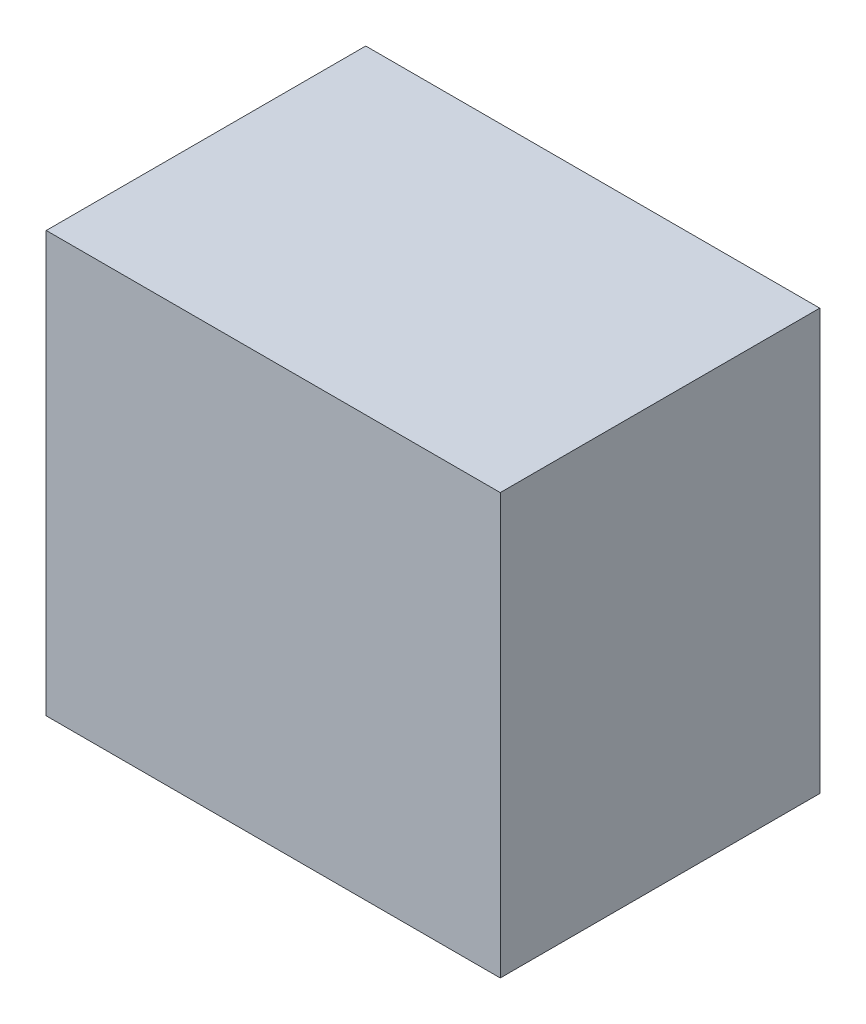
ISO-10303-21;
HEADER;
FILE_DESCRIPTION(('STEP AP214'),'2;1');
FILE_NAME('part.step','',(''),(''),'','','');
FILE_SCHEMA(('AUTOMOTIVE_DESIGN { 1 0 10303 214 1 1 1 1 }'));
ENDSEC;
DATA;
#1=APPLICATION_CONTEXT('core data for automotive mechanical design processes');
#2=APPLICATION_PROTOCOL_DEFINITION('international standard','automotive_design',2000,#1);
#3=PRODUCT_CONTEXT('',#1,'mechanical');
#4=PRODUCT('Part','Part','',(#3));
#5=PRODUCT_RELATED_PRODUCT_CATEGORY('part','',(#4));
#6=PRODUCT_DEFINITION_FORMATION('','',#4);
#7=PRODUCT_DEFINITION_CONTEXT('part definition',#1,'design');
#8=PRODUCT_DEFINITION('design','',#6,#7);
#9=PRODUCT_DEFINITION_SHAPE('','',#8);
#10=(LENGTH_UNIT() NAMED_UNIT(*) SI_UNIT(.MILLI.,.METRE.));
#11=(NAMED_UNIT(*) PLANE_ANGLE_UNIT() SI_UNIT($,.RADIAN.));
#12=(NAMED_UNIT(*) SI_UNIT($,.STERADIAN.) SOLID_ANGLE_UNIT());
#13=UNCERTAINTY_MEASURE_WITH_UNIT(LENGTH_MEASURE(1.E-05),#10,'distance_accuracy_value','');
#14=(GEOMETRIC_REPRESENTATION_CONTEXT(3) GLOBAL_UNCERTAINTY_ASSIGNED_CONTEXT((#13)) GLOBAL_UNIT_ASSIGNED_CONTEXT((#10,
#11,#12)) REPRESENTATION_CONTEXT('',''));
#15=CARTESIAN_POINT('',(0.,0.,0.));
#16=DIRECTION('',(0.,0.,1.));
#17=DIRECTION('',(1.,0.,0.));
#18=AXIS2_PLACEMENT_3D('',#15,#16,#17);
#19=CARTESIAN_POINT('',(0.,5.,0.));
#20=DIRECTION('',(1.,0.,0.));
#21=DIRECTION('',(0.,0.,-1.));
#22=AXIS2_PLACEMENT_3D('',#19,#20,#21);
#23=PLANE('',#22);
#24=DIRECTION('',(0.,0.,1.));
#25=VECTOR('',#24,1.);
#26=CARTESIAN_POINT('',(0.,0.,0.));
#27=LINE('',#26,#25);
#28=CARTESIAN_POINT('',(0.,0.,-3.8));
#29=VERTEX_POINT('',#28);
#30=CARTESIAN_POINT('',(0.,0.,0.));
#31=VERTEX_POINT('',#30);
#32=EDGE_CURVE('E98',#29,#31,#27,.T.);
#33=ORIENTED_EDGE('',*,*,#32,.T.);
#34=DIRECTION('',(0.,-1.,0.));
#35=VECTOR('',#34,1.);
#36=CARTESIAN_POINT('',(0.,5.,0.));
#37=LINE('',#36,#35);
#38=CARTESIAN_POINT('',(0.,5.,0.));
#39=VERTEX_POINT('',#38);
#40=EDGE_CURVE('E11',#39,#31,#37,.T.);
#41=ORIENTED_EDGE('',*,*,#40,.F.);
#42=DIRECTION('',(0.,0.,1.));
#43=VECTOR('',#42,1.);
#44=CARTESIAN_POINT('',(0.,5.,0.));
#45=LINE('',#44,#43);
#46=CARTESIAN_POINT('',(0.,5.,-3.8));
#47=VERTEX_POINT('',#46);
#48=EDGE_CURVE('E86',#47,#39,#45,.T.);
#49=ORIENTED_EDGE('',*,*,#48,.F.);
#50=DIRECTION('',(0.,-1.,0.));
#51=VECTOR('',#50,1.);
#52=CARTESIAN_POINT('',(0.,5.,-3.8));
#53=LINE('',#52,#51);
#54=EDGE_CURVE('E94',#47,#29,#53,.T.);
#55=ORIENTED_EDGE('',*,*,#54,.T.);
#56=EDGE_LOOP('',(#33,#41,#49,#55));
#57=FACE_BOUND('',#56,.T.);
#58=ADVANCED_FACE('F35',(#57),#23,.F.);
#59=CARTESIAN_POINT('',(0.,5.,0.));
#60=DIRECTION('',(0.,0.,-1.));
#61=DIRECTION('',(-1.,0.,0.));
#62=AXIS2_PLACEMENT_3D('',#59,#60,#61);
#63=PLANE('',#62);
#64=DIRECTION('',(1.,0.,0.));
#65=VECTOR('',#64,1.);
#66=CARTESIAN_POINT('',(0.,0.,0.));
#67=LINE('',#66,#65);
#68=CARTESIAN_POINT('',(5.4,0.,0.));
#69=VERTEX_POINT('',#68);
#70=EDGE_CURVE('E90',#31,#69,#67,.T.);
#71=ORIENTED_EDGE('',*,*,#70,.T.);
#72=DIRECTION('',(0.,-1.,0.));
#73=VECTOR('',#72,1.);
#74=CARTESIAN_POINT('',(5.4,5.,0.));
#75=LINE('',#74,#73);
#76=CARTESIAN_POINT('',(5.4,5.,0.));
#77=VERTEX_POINT('',#76);
#78=EDGE_CURVE('E43',#77,#69,#75,.T.);
#79=ORIENTED_EDGE('',*,*,#78,.F.);
#80=DIRECTION('',(1.,0.,0.));
#81=VECTOR('',#80,1.);
#82=CARTESIAN_POINT('',(0.,5.,0.));
#83=LINE('',#82,#81);
#84=EDGE_CURVE('E81',#39,#77,#83,.T.);
#85=ORIENTED_EDGE('',*,*,#84,.F.);
#86=ORIENTED_EDGE('',*,*,#40,.T.);
#87=EDGE_LOOP('',(#71,#79,#85,#86));
#88=FACE_BOUND('',#87,.T.);
#89=ADVANCED_FACE('F89',(#88),#63,.F.);
#90=CARTESIAN_POINT('',(5.4,5.,0.));
#91=DIRECTION('',(-1.,0.,0.));
#92=DIRECTION('',(0.,0.,1.));
#93=AXIS2_PLACEMENT_3D('',#90,#91,#92);
#94=PLANE('',#93);
#95=DIRECTION('',(0.,0.,-1.));
#96=VECTOR('',#95,1.);
#97=CARTESIAN_POINT('',(5.4,0.,0.));
#98=LINE('',#97,#96);
#99=CARTESIAN_POINT('',(5.4,0.,-3.8));
#100=VERTEX_POINT('',#99);
#101=EDGE_CURVE('E68',#69,#100,#98,.T.);
#102=ORIENTED_EDGE('',*,*,#101,.T.);
#103=DIRECTION('',(0.,-1.,0.));
#104=VECTOR('',#103,1.);
#105=CARTESIAN_POINT('',(5.4,5.,-3.8));
#106=LINE('',#105,#104);
#107=CARTESIAN_POINT('',(5.4,5.,-3.8));
#108=VERTEX_POINT('',#107);
#109=EDGE_CURVE('E91',#108,#100,#106,.T.);
#110=ORIENTED_EDGE('',*,*,#109,.F.);
#111=DIRECTION('',(0.,0.,-1.));
#112=VECTOR('',#111,1.);
#113=CARTESIAN_POINT('',(5.4,5.,0.));
#114=LINE('',#113,#112);
#115=EDGE_CURVE('E84',#77,#108,#114,.T.);
#116=ORIENTED_EDGE('',*,*,#115,.F.);
#117=ORIENTED_EDGE('',*,*,#78,.T.);
#118=EDGE_LOOP('',(#102,#110,#116,#117));
#119=FACE_BOUND('',#118,.T.);
#120=ADVANCED_FACE('F92',(#119),#94,.F.);
#121=CARTESIAN_POINT('',(0.,5.,-3.8));
#122=DIRECTION('',(0.,0.,1.));
#123=DIRECTION('',(1.,0.,0.));
#124=AXIS2_PLACEMENT_3D('',#121,#122,#123);
#125=PLANE('',#124);
#126=DIRECTION('',(-1.,0.,0.));
#127=VECTOR('',#126,1.);
#128=CARTESIAN_POINT('',(0.,0.,-3.8));
#129=LINE('',#128,#127);
#130=EDGE_CURVE('E74',#100,#29,#129,.T.);
#131=ORIENTED_EDGE('',*,*,#130,.T.);
#132=ORIENTED_EDGE('',*,*,#54,.F.);
#133=DIRECTION('',(-1.,0.,0.));
#134=VECTOR('',#133,1.);
#135=CARTESIAN_POINT('',(0.,5.,-3.8));
#136=LINE('',#135,#134);
#137=EDGE_CURVE('E51',#108,#47,#136,.T.);
#138=ORIENTED_EDGE('',*,*,#137,.F.);
#139=ORIENTED_EDGE('',*,*,#109,.T.);
#140=EDGE_LOOP('',(#131,#132,#138,#139));
#141=FACE_BOUND('',#140,.T.);
#142=ADVANCED_FACE('F105',(#141),#125,.F.);
#143=CARTESIAN_POINT('',(0.,5.,0.));
#144=DIRECTION('',(0.,-1.,0.));
#145=DIRECTION('',(0.,0.,-1.));
#146=AXIS2_PLACEMENT_3D('',#143,#144,#145);
#147=PLANE('',#146);
#148=ORIENTED_EDGE('',*,*,#48,.T.);
#149=ORIENTED_EDGE('',*,*,#84,.T.);
#150=ORIENTED_EDGE('',*,*,#115,.T.);
#151=ORIENTED_EDGE('',*,*,#137,.T.);
#152=EDGE_LOOP('',(#148,#149,#150,#151));
#153=FACE_BOUND('',#152,.T.);
#154=ADVANCED_FACE('F82',(#153),#147,.F.);
#155=CARTESIAN_POINT('',(0.,0.,0.));
#156=DIRECTION('',(0.,-1.,0.));
#157=DIRECTION('',(0.,0.,-1.));
#158=AXIS2_PLACEMENT_3D('',#155,#156,#157);
#159=PLANE('',#158);
#160=ORIENTED_EDGE('',*,*,#32,.F.);
#161=ORIENTED_EDGE('',*,*,#130,.F.);
#162=ORIENTED_EDGE('',*,*,#101,.F.);
#163=ORIENTED_EDGE('',*,*,#70,.F.);
#164=EDGE_LOOP('',(#160,#161,#162,#163));
#165=FACE_BOUND('',#164,.T.);
#166=ADVANCED_FACE('F108',(#165),#159,.T.);
#167=CLOSED_SHELL('',(#58,#89,#120,#142,#154,#166));
#168=MANIFOLD_SOLID_BREP('B2',#167);
#169=ADVANCED_BREP_SHAPE_REPRESENTATION('',(#18,#168),#14);
#170=SHAPE_DEFINITION_REPRESENTATION(#9,#169);
ENDSEC;
END-ISO-10303-21;
